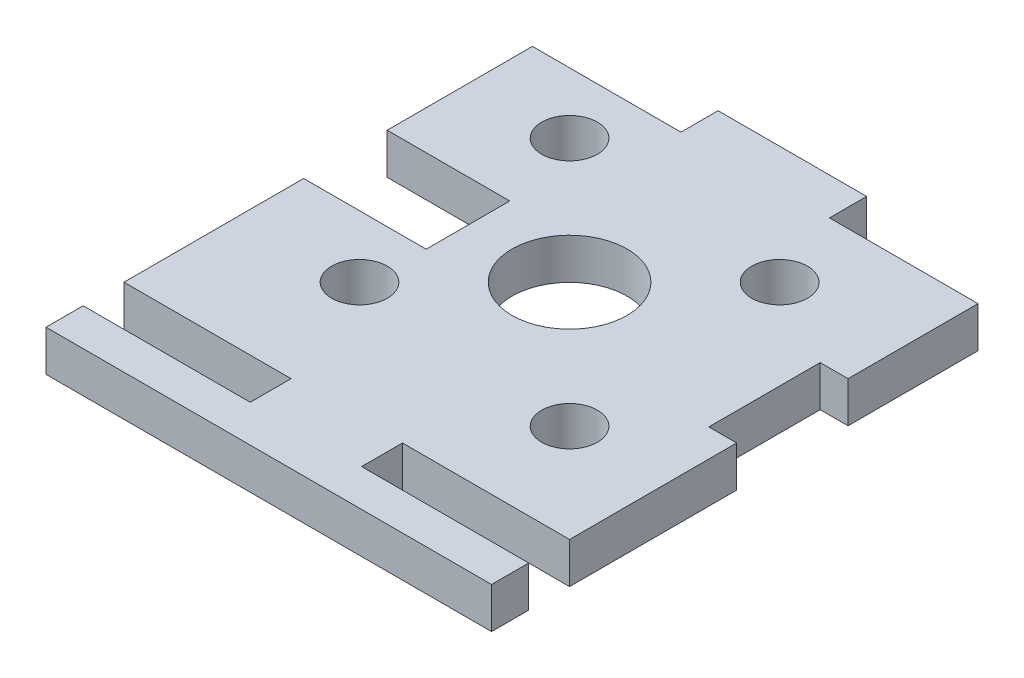
ISO-10303-21;
HEADER;
FILE_DESCRIPTION(('STEP AP214'),'2;1');
FILE_NAME('part.step','',(''),(''),'','','');
FILE_SCHEMA(('AUTOMOTIVE_DESIGN { 1 0 10303 214 1 1 1 1 }'));
ENDSEC;
DATA;
#1=APPLICATION_CONTEXT('core data for automotive mechanical design processes');
#2=APPLICATION_PROTOCOL_DEFINITION('international standard','automotive_design',2000,#1);
#3=PRODUCT_CONTEXT('',#1,'mechanical');
#4=PRODUCT('Part','Part','',(#3));
#5=PRODUCT_RELATED_PRODUCT_CATEGORY('part','',(#4));
#6=PRODUCT_DEFINITION_FORMATION('','',#4);
#7=PRODUCT_DEFINITION_CONTEXT('part definition',#1,'design');
#8=PRODUCT_DEFINITION('design','',#6,#7);
#9=PRODUCT_DEFINITION_SHAPE('','',#8);
#10=(LENGTH_UNIT() NAMED_UNIT(*) SI_UNIT(.MILLI.,.METRE.));
#11=(NAMED_UNIT(*) PLANE_ANGLE_UNIT() SI_UNIT($,.RADIAN.));
#12=(NAMED_UNIT(*) SI_UNIT($,.STERADIAN.) SOLID_ANGLE_UNIT());
#13=UNCERTAINTY_MEASURE_WITH_UNIT(LENGTH_MEASURE(1.E-05),#10,'distance_accuracy_value','');
#14=(GEOMETRIC_REPRESENTATION_CONTEXT(3) GLOBAL_UNCERTAINTY_ASSIGNED_CONTEXT((#13)) GLOBAL_UNIT_ASSIGNED_CONTEXT((#10,
#11,#12)) REPRESENTATION_CONTEXT('',''));
#15=CARTESIAN_POINT('',(0.,0.,0.));
#16=DIRECTION('',(0.,0.,1.));
#17=DIRECTION('',(1.,0.,0.));
#18=AXIS2_PLACEMENT_3D('',#15,#16,#17);
#19=CARTESIAN_POINT('',(-138.695425431337,2.2,0.));
#20=DIRECTION('',(-1.,0.,0.));
#21=DIRECTION('',(0.,0.,1.));
#22=AXIS2_PLACEMENT_3D('',#19,#20,#21);
#23=PLANE('',#22);
#24=DIRECTION('',(0.,0.,-1.));
#25=VECTOR('',#24,1.);
#26=CARTESIAN_POINT('',(-138.695425431337,0.,0.));
#27=LINE('',#26,#25);
#28=CARTESIAN_POINT('',(-138.695425431337,0.,51.8659042385541));
#29=VERTEX_POINT('',#28);
#30=CARTESIAN_POINT('',(-138.695425431337,0.,45.865904238554));
#31=VERTEX_POINT('',#30);
#32=EDGE_CURVE('E312',#29,#31,#27,.T.);
#33=ORIENTED_EDGE('',*,*,#32,.T.);
#34=DIRECTION('',(0.,-1.,0.));
#35=VECTOR('',#34,1.);
#36=CARTESIAN_POINT('',(-138.695425431337,2.2,45.865904238554));
#37=LINE('',#36,#35);
#38=CARTESIAN_POINT('',(-138.695425431337,2.2,45.865904238554));
#39=VERTEX_POINT('',#38);
#40=EDGE_CURVE('E11',#39,#31,#37,.T.);
#41=ORIENTED_EDGE('',*,*,#40,.F.);
#42=DIRECTION('',(0.,0.,-1.));
#43=VECTOR('',#42,1.);
#44=CARTESIAN_POINT('',(-138.695425431337,2.2,0.));
#45=LINE('',#44,#43);
#46=CARTESIAN_POINT('',(-138.695425431337,2.2,51.8659042385541));
#47=VERTEX_POINT('',#46);
#48=EDGE_CURVE('E234',#47,#39,#45,.T.);
#49=ORIENTED_EDGE('',*,*,#48,.F.);
#50=DIRECTION('',(0.,-1.,0.));
#51=VECTOR('',#50,1.);
#52=CARTESIAN_POINT('',(-138.695425431337,2.2,51.8659042385541));
#53=LINE('',#52,#51);
#54=EDGE_CURVE('E225',#47,#29,#53,.T.);
#55=ORIENTED_EDGE('',*,*,#54,.T.);
#56=EDGE_LOOP('',(#33,#41,#49,#55));
#57=FACE_BOUND('',#56,.T.);
#58=ADVANCED_FACE('F37',(#57),#23,.F.);
#59=CARTESIAN_POINT('',(-8.48689715514936E-13,2.2,45.8659042385566));
#60=DIRECTION('',(0.,0.,-1.));
#61=DIRECTION('',(-1.,0.,0.));
#62=AXIS2_PLACEMENT_3D('',#59,#60,#61);
#63=PLANE('',#62);
#64=DIRECTION('',(1.,0.,0.));
#65=VECTOR('',#64,1.);
#66=CARTESIAN_POINT('',(-8.48689715514936E-13,0.,45.8659042385566));
#67=LINE('',#66,#65);
#68=CARTESIAN_POINT('',(-137.195425431329,0.,45.865904238554));
#69=VERTEX_POINT('',#68);
#70=EDGE_CURVE('E306',#31,#69,#67,.T.);
#71=ORIENTED_EDGE('',*,*,#70,.T.);
#72=DIRECTION('',(0.,-1.,0.));
#73=VECTOR('',#72,1.);
#74=CARTESIAN_POINT('',(-137.195425431329,2.2,45.865904238554));
#75=LINE('',#74,#73);
#76=CARTESIAN_POINT('',(-137.195425431329,2.2,45.865904238554));
#77=VERTEX_POINT('',#76);
#78=EDGE_CURVE('E46',#77,#69,#75,.T.);
#79=ORIENTED_EDGE('',*,*,#78,.F.);
#80=DIRECTION('',(1.,0.,0.));
#81=VECTOR('',#80,1.);
#82=CARTESIAN_POINT('',(-8.48689715514936E-13,2.2,45.8659042385566));
#83=LINE('',#82,#81);
#84=EDGE_CURVE('E141',#39,#77,#83,.T.);
#85=ORIENTED_EDGE('',*,*,#84,.F.);
#86=ORIENTED_EDGE('',*,*,#40,.T.);
#87=EDGE_LOOP('',(#71,#79,#85,#86));
#88=FACE_BOUND('',#87,.T.);
#89=ADVANCED_FACE('F307',(#88),#63,.F.);
#90=CARTESIAN_POINT('',(-137.195425431329,2.2,0.));
#91=DIRECTION('',(1.,0.,0.));
#92=DIRECTION('',(0.,0.,-1.));
#93=AXIS2_PLACEMENT_3D('',#90,#91,#92);
#94=PLANE('',#93);
#95=DIRECTION('',(0.,0.,1.));
#96=VECTOR('',#95,1.);
#97=CARTESIAN_POINT('',(-137.195425431329,0.,0.));
#98=LINE('',#97,#96);
#99=CARTESIAN_POINT('',(-137.195425431329,0.,38.8659042385536));
#100=VERTEX_POINT('',#99);
#101=EDGE_CURVE('E256',#100,#69,#98,.T.);
#102=ORIENTED_EDGE('',*,*,#101,.F.);
#103=DIRECTION('',(0.,-1.,0.));
#104=VECTOR('',#103,1.);
#105=CARTESIAN_POINT('',(-137.195425431329,2.2,38.8659042385536));
#106=LINE('',#105,#104);
#107=CARTESIAN_POINT('',(-137.195425431329,2.2,38.8659042385536));
#108=VERTEX_POINT('',#107);
#109=EDGE_CURVE('E301',#108,#100,#106,.T.);
#110=ORIENTED_EDGE('',*,*,#109,.F.);
#111=DIRECTION('',(0.,0.,1.));
#112=VECTOR('',#111,1.);
#113=CARTESIAN_POINT('',(-137.195425431329,2.2,0.));
#114=LINE('',#113,#112);
#115=EDGE_CURVE('E224',#108,#77,#114,.T.);
#116=ORIENTED_EDGE('',*,*,#115,.T.);
#117=ORIENTED_EDGE('',*,*,#78,.T.);
#118=EDGE_LOOP('',(#102,#110,#116,#117));
#119=FACE_BOUND('',#118,.T.);
#120=ADVANCED_FACE('F304',(#119),#94,.T.);
#121=CARTESIAN_POINT('',(-5.3937277198151E-13,2.2,38.8659042385556));
#122=DIRECTION('',(0.,0.,1.));
#123=DIRECTION('',(1.,0.,0.));
#124=AXIS2_PLACEMENT_3D('',#121,#122,#123);
#125=PLANE('',#124);
#126=DIRECTION('',(-1.,0.,0.));
#127=VECTOR('',#126,1.);
#128=CARTESIAN_POINT('',(-5.3937277198151E-13,0.,38.8659042385556));
#129=LINE('',#128,#127);
#130=CARTESIAN_POINT('',(-145.195425431338,0.,38.8659042385536));
#131=VERTEX_POINT('',#130);
#132=EDGE_CURVE('E317',#100,#131,#129,.T.);
#133=ORIENTED_EDGE('',*,*,#132,.T.);
#134=DIRECTION('',(0.,-1.,0.));
#135=VECTOR('',#134,1.);
#136=CARTESIAN_POINT('',(-145.195425431338,2.2,38.8659042385536));
#137=LINE('',#136,#135);
#138=CARTESIAN_POINT('',(-145.195425431338,2.2,38.8659042385536));
#139=VERTEX_POINT('',#138);
#140=EDGE_CURVE('E298',#139,#131,#137,.T.);
#141=ORIENTED_EDGE('',*,*,#140,.F.);
#142=DIRECTION('',(-1.,0.,0.));
#143=VECTOR('',#142,1.);
#144=CARTESIAN_POINT('',(-5.3937277198151E-13,2.2,38.8659042385556));
#145=LINE('',#144,#143);
#146=EDGE_CURVE('E230',#108,#139,#145,.T.);
#147=ORIENTED_EDGE('',*,*,#146,.F.);
#148=ORIENTED_EDGE('',*,*,#109,.T.);
#149=EDGE_LOOP('',(#133,#141,#147,#148));
#150=FACE_BOUND('',#149,.T.);
#151=ADVANCED_FACE('F560',(#150),#125,.F.);
#152=CARTESIAN_POINT('',(-145.195425431338,2.2,0.));
#153=DIRECTION('',(-1.,0.,0.));
#154=DIRECTION('',(0.,0.,1.));
#155=AXIS2_PLACEMENT_3D('',#152,#153,#154);
#156=PLANE('',#155);
#157=DIRECTION('',(0.,0.,-1.));
#158=VECTOR('',#157,1.);
#159=CARTESIAN_POINT('',(-145.195425431338,0.,0.));
#160=LINE('',#159,#158);
#161=CARTESIAN_POINT('',(-145.195425431338,0.,36.8659042385471));
#162=VERTEX_POINT('',#161);
#163=EDGE_CURVE('E318',#131,#162,#160,.T.);
#164=ORIENTED_EDGE('',*,*,#163,.T.);
#165=DIRECTION('',(0.,-1.,0.));
#166=VECTOR('',#165,1.);
#167=CARTESIAN_POINT('',(-145.195425431338,2.2,36.8659042385471));
#168=LINE('',#167,#166);
#169=CARTESIAN_POINT('',(-145.195425431338,2.2,36.8659042385471));
#170=VERTEX_POINT('',#169);
#171=EDGE_CURVE('E295',#170,#162,#168,.T.);
#172=ORIENTED_EDGE('',*,*,#171,.F.);
#173=DIRECTION('',(0.,0.,-1.));
#174=VECTOR('',#173,1.);
#175=CARTESIAN_POINT('',(-145.195425431338,2.2,0.));
#176=LINE('',#175,#174);
#177=EDGE_CURVE('E233',#139,#170,#176,.T.);
#178=ORIENTED_EDGE('',*,*,#177,.F.);
#179=ORIENTED_EDGE('',*,*,#140,.T.);
#180=EDGE_LOOP('',(#164,#172,#178,#179));
#181=FACE_BOUND('',#180,.T.);
#182=ADVANCED_FACE('F433',(#181),#156,.F.);
#183=CARTESIAN_POINT('',(0.,2.2,36.8659042385471));
#184=DIRECTION('',(0.,0.,1.));
#185=DIRECTION('',(1.,0.,0.));
#186=AXIS2_PLACEMENT_3D('',#183,#184,#185);
#187=PLANE('',#186);
#188=DIRECTION('',(-1.,0.,0.));
#189=VECTOR('',#188,1.);
#190=CARTESIAN_POINT('',(0.,0.,36.8659042385471));
#191=LINE('',#190,#189);
#192=CARTESIAN_POINT('',(-153.195425431338,0.,36.8659042385471));
#193=VERTEX_POINT('',#192);
#194=EDGE_CURVE('E323',#162,#193,#191,.T.);
#195=ORIENTED_EDGE('',*,*,#194,.T.);
#196=DIRECTION('',(0.,-1.,0.));
#197=VECTOR('',#196,1.);
#198=CARTESIAN_POINT('',(-153.195425431338,2.2,36.8659042385471));
#199=LINE('',#198,#197);
#200=CARTESIAN_POINT('',(-153.195425431338,2.2,36.8659042385471));
#201=VERTEX_POINT('',#200);
#202=EDGE_CURVE('E292',#201,#193,#199,.T.);
#203=ORIENTED_EDGE('',*,*,#202,.F.);
#204=DIRECTION('',(-1.,0.,0.));
#205=VECTOR('',#204,1.);
#206=CARTESIAN_POINT('',(0.,2.2,36.8659042385471));
#207=LINE('',#206,#205);
#208=EDGE_CURVE('E424',#170,#201,#207,.T.);
#209=ORIENTED_EDGE('',*,*,#208,.F.);
#210=ORIENTED_EDGE('',*,*,#171,.T.);
#211=EDGE_LOOP('',(#195,#203,#209,#210));
#212=FACE_BOUND('',#211,.T.);
#213=ADVANCED_FACE('F436',(#212),#187,.F.);
#214=CARTESIAN_POINT('',(-153.195425431338,2.2,0.));
#215=DIRECTION('',(1.,0.,0.));
#216=DIRECTION('',(0.,0.,-1.));
#217=AXIS2_PLACEMENT_3D('',#214,#215,#216);
#218=PLANE('',#217);
#219=DIRECTION('',(0.,0.,1.));
#220=VECTOR('',#219,1.);
#221=CARTESIAN_POINT('',(-153.195425431338,0.,0.));
#222=LINE('',#221,#220);
#223=CARTESIAN_POINT('',(-153.195425431338,0.,38.8659042385533));
#224=VERTEX_POINT('',#223);
#225=EDGE_CURVE('E325',#193,#224,#222,.T.);
#226=ORIENTED_EDGE('',*,*,#225,.T.);
#227=DIRECTION('',(0.,-1.,0.));
#228=VECTOR('',#227,1.);
#229=CARTESIAN_POINT('',(-153.195425431338,2.2,38.8659042385533));
#230=LINE('',#229,#228);
#231=CARTESIAN_POINT('',(-153.195425431338,2.2,38.8659042385533));
#232=VERTEX_POINT('',#231);
#233=EDGE_CURVE('E289',#232,#224,#230,.T.);
#234=ORIENTED_EDGE('',*,*,#233,.F.);
#235=DIRECTION('',(0.,0.,1.));
#236=VECTOR('',#235,1.);
#237=CARTESIAN_POINT('',(-153.195425431338,2.2,0.));
#238=LINE('',#237,#236);
#239=EDGE_CURVE('E422',#201,#232,#238,.T.);
#240=ORIENTED_EDGE('',*,*,#239,.F.);
#241=ORIENTED_EDGE('',*,*,#202,.T.);
#242=EDGE_LOOP('',(#226,#234,#240,#241));
#243=FACE_BOUND('',#242,.T.);
#244=ADVANCED_FACE('F441',(#243),#218,.F.);
#245=CARTESIAN_POINT('',(-5.39372771981501E-13,2.2,38.8659042385555));
#246=DIRECTION('',(0.,0.,1.));
#247=DIRECTION('',(1.,0.,0.));
#248=AXIS2_PLACEMENT_3D('',#245,#246,#247);
#249=PLANE('',#248);
#250=DIRECTION('',(-1.,0.,0.));
#251=VECTOR('',#250,1.);
#252=CARTESIAN_POINT('',(-5.39372771981501E-13,0.,38.8659042385555));
#253=LINE('',#252,#251);
#254=CARTESIAN_POINT('',(-161.195425431338,0.,38.8659042385532));
#255=VERTEX_POINT('',#254);
#256=EDGE_CURVE('E327',#224,#255,#253,.T.);
#257=ORIENTED_EDGE('',*,*,#256,.T.);
#258=DIRECTION('',(0.,-1.,0.));
#259=VECTOR('',#258,1.);
#260=CARTESIAN_POINT('',(-161.195425431338,2.2,38.8659042385532));
#261=LINE('',#260,#259);
#262=CARTESIAN_POINT('',(-161.195425431338,2.2,38.8659042385532));
#263=VERTEX_POINT('',#262);
#264=EDGE_CURVE('E287',#263,#255,#261,.T.);
#265=ORIENTED_EDGE('',*,*,#264,.F.);
#266=DIRECTION('',(-1.,0.,0.));
#267=VECTOR('',#266,1.);
#268=CARTESIAN_POINT('',(-5.39372771981501E-13,2.2,38.8659042385555));
#269=LINE('',#268,#267);
#270=EDGE_CURVE('E420',#232,#263,#269,.T.);
#271=ORIENTED_EDGE('',*,*,#270,.F.);
#272=ORIENTED_EDGE('',*,*,#233,.T.);
#273=EDGE_LOOP('',(#257,#265,#271,#272));
#274=FACE_BOUND('',#273,.T.);
#275=ADVANCED_FACE('F447',(#274),#249,.F.);
#276=CARTESIAN_POINT('',(-161.195425431344,2.2,0.));
#277=DIRECTION('',(-1.,0.,0.));
#278=DIRECTION('',(0.,0.,1.));
#279=AXIS2_PLACEMENT_3D('',#276,#277,#278);
#280=PLANE('',#279);
#281=DIRECTION('',(0.,0.,-1.));
#282=VECTOR('',#281,1.);
#283=CARTESIAN_POINT('',(-161.195425431344,0.,0.));
#284=LINE('',#283,#282);
#285=CARTESIAN_POINT('',(-161.195425431344,0.,46.6878762578517));
#286=VERTEX_POINT('',#285);
#287=EDGE_CURVE('E330',#286,#255,#284,.T.);
#288=ORIENTED_EDGE('',*,*,#287,.F.);
#289=DIRECTION('',(0.,-1.,0.));
#290=VECTOR('',#289,1.);
#291=CARTESIAN_POINT('',(-161.195425431344,2.2,46.6878762578517));
#292=LINE('',#291,#290);
#293=CARTESIAN_POINT('',(-161.195425431344,2.2,46.6878762578517));
#294=VERTEX_POINT('',#293);
#295=EDGE_CURVE('E285',#294,#286,#292,.T.);
#296=ORIENTED_EDGE('',*,*,#295,.F.);
#297=DIRECTION('',(0.,0.,-1.));
#298=VECTOR('',#297,1.);
#299=CARTESIAN_POINT('',(-161.195425431344,2.2,0.));
#300=LINE('',#299,#298);
#301=EDGE_CURVE('E417',#294,#263,#300,.T.);
#302=ORIENTED_EDGE('',*,*,#301,.T.);
#303=ORIENTED_EDGE('',*,*,#264,.T.);
#304=EDGE_LOOP('',(#288,#296,#302,#303));
#305=FACE_BOUND('',#304,.T.);
#306=ADVANCED_FACE('F451',(#305),#280,.T.);
#307=CARTESIAN_POINT('',(0.,2.2,46.6878762578517));
#308=DIRECTION('',(0.,0.,1.));
#309=DIRECTION('',(1.,0.,0.));
#310=AXIS2_PLACEMENT_3D('',#307,#308,#309);
#311=PLANE('',#310);
#312=DIRECTION('',(-1.,0.,0.));
#313=VECTOR('',#312,1.);
#314=CARTESIAN_POINT('',(0.,0.,46.6878762578517));
#315=LINE('',#314,#313);
#316=CARTESIAN_POINT('',(-154.595425431342,0.,46.6878762578517));
#317=VERTEX_POINT('',#316);
#318=EDGE_CURVE('E333',#317,#286,#315,.T.);
#319=ORIENTED_EDGE('',*,*,#318,.F.);
#320=DIRECTION('',(0.,-1.,0.));
#321=VECTOR('',#320,1.);
#322=CARTESIAN_POINT('',(-154.595425431342,2.2,46.6878762578517));
#323=LINE('',#322,#321);
#324=CARTESIAN_POINT('',(-154.595425431342,2.2,46.6878762578517));
#325=VERTEX_POINT('',#324);
#326=EDGE_CURVE('E283',#325,#317,#323,.T.);
#327=ORIENTED_EDGE('',*,*,#326,.F.);
#328=DIRECTION('',(-1.,0.,0.));
#329=VECTOR('',#328,1.);
#330=CARTESIAN_POINT('',(0.,2.2,46.6878762578517));
#331=LINE('',#330,#329);
#332=EDGE_CURVE('E414',#325,#294,#331,.T.);
#333=ORIENTED_EDGE('',*,*,#332,.T.);
#334=ORIENTED_EDGE('',*,*,#295,.T.);
#335=EDGE_LOOP('',(#319,#327,#333,#334));
#336=FACE_BOUND('',#335,.T.);
#337=ADVANCED_FACE('F454',(#336),#311,.T.);
#338=CARTESIAN_POINT('',(-154.595425431342,2.2,0.));
#339=DIRECTION('',(-1.,0.,0.));
#340=DIRECTION('',(0.,0.,1.));
#341=AXIS2_PLACEMENT_3D('',#338,#339,#340);
#342=PLANE('',#341);
#343=DIRECTION('',(0.,0.,-1.));
#344=VECTOR('',#343,1.);
#345=CARTESIAN_POINT('',(-154.595425431342,0.,0.));
#346=LINE('',#345,#344);
#347=CARTESIAN_POINT('',(-154.595425431342,0.,51.1878762578712));
#348=VERTEX_POINT('',#347);
#349=EDGE_CURVE('E336',#348,#317,#346,.T.);
#350=ORIENTED_EDGE('',*,*,#349,.F.);
#351=DIRECTION('',(0.,-1.,0.));
#352=VECTOR('',#351,1.);
#353=CARTESIAN_POINT('',(-154.595425431342,2.2,51.1878762578712));
#354=LINE('',#353,#352);
#355=CARTESIAN_POINT('',(-154.595425431342,2.2,51.1878762578712));
#356=VERTEX_POINT('',#355);
#357=EDGE_CURVE('E281',#356,#348,#354,.T.);
#358=ORIENTED_EDGE('',*,*,#357,.F.);
#359=DIRECTION('',(0.,0.,-1.));
#360=VECTOR('',#359,1.);
#361=CARTESIAN_POINT('',(-154.595425431342,2.2,0.));
#362=LINE('',#361,#360);
#363=EDGE_CURVE('E411',#356,#325,#362,.T.);
#364=ORIENTED_EDGE('',*,*,#363,.T.);
#365=ORIENTED_EDGE('',*,*,#326,.T.);
#366=EDGE_LOOP('',(#350,#358,#364,#365));
#367=FACE_BOUND('',#366,.T.);
#368=ADVANCED_FACE('F458',(#367),#342,.T.);
#369=CARTESIAN_POINT('',(0.,2.2,51.1878762578712));
#370=DIRECTION('',(0.,0.,1.));
#371=DIRECTION('',(1.,0.,0.));
#372=AXIS2_PLACEMENT_3D('',#369,#370,#371);
#373=PLANE('',#372);
#374=DIRECTION('',(-1.,0.,0.));
#375=VECTOR('',#374,1.);
#376=CARTESIAN_POINT('',(0.,0.,51.1878762578712));
#377=LINE('',#376,#375);
#378=CARTESIAN_POINT('',(-161.195425431344,0.,51.1878762578712));
#379=VERTEX_POINT('',#378);
#380=EDGE_CURVE('E339',#348,#379,#377,.T.);
#381=ORIENTED_EDGE('',*,*,#380,.T.);
#382=DIRECTION('',(0.,-1.,0.));
#383=VECTOR('',#382,1.);
#384=CARTESIAN_POINT('',(-161.195425431344,2.2,51.1878762578712));
#385=LINE('',#384,#383);
#386=CARTESIAN_POINT('',(-161.195425431344,2.2,51.1878762578712));
#387=VERTEX_POINT('',#386);
#388=EDGE_CURVE('E279',#387,#379,#385,.T.);
#389=ORIENTED_EDGE('',*,*,#388,.F.);
#390=DIRECTION('',(-1.,0.,0.));
#391=VECTOR('',#390,1.);
#392=CARTESIAN_POINT('',(0.,2.2,51.1878762578712));
#393=LINE('',#392,#391);
#394=EDGE_CURVE('E409',#356,#387,#393,.T.);
#395=ORIENTED_EDGE('',*,*,#394,.F.);
#396=ORIENTED_EDGE('',*,*,#357,.T.);
#397=EDGE_LOOP('',(#381,#389,#395,#396));
#398=FACE_BOUND('',#397,.T.);
#399=ADVANCED_FACE('F463',(#398),#373,.F.);
#400=CARTESIAN_POINT('',(-161.195425431344,2.2,0.));
#401=DIRECTION('',(-1.,0.,0.));
#402=DIRECTION('',(0.,0.,1.));
#403=AXIS2_PLACEMENT_3D('',#400,#401,#402);
#404=PLANE('',#403);
#405=DIRECTION('',(0.,0.,-1.));
#406=VECTOR('',#405,1.);
#407=CARTESIAN_POINT('',(-161.195425431344,0.,0.));
#408=LINE('',#407,#406);
#409=CARTESIAN_POINT('',(-161.195425431344,0.,60.8659042385175));
#410=VERTEX_POINT('',#409);
#411=EDGE_CURVE('E342',#410,#379,#408,.T.);
#412=ORIENTED_EDGE('',*,*,#411,.F.);
#413=DIRECTION('',(0.,-1.,0.));
#414=VECTOR('',#413,1.);
#415=CARTESIAN_POINT('',(-161.195425431344,2.2,60.8659042385175));
#416=LINE('',#415,#414);
#417=CARTESIAN_POINT('',(-161.195425431344,2.2,60.8659042385175));
#418=VERTEX_POINT('',#417);
#419=EDGE_CURVE('E277',#418,#410,#416,.T.);
#420=ORIENTED_EDGE('',*,*,#419,.F.);
#421=DIRECTION('',(0.,0.,-1.));
#422=VECTOR('',#421,1.);
#423=CARTESIAN_POINT('',(-161.195425431344,2.2,0.));
#424=LINE('',#423,#422);
#425=EDGE_CURVE('E406',#418,#387,#424,.T.);
#426=ORIENTED_EDGE('',*,*,#425,.T.);
#427=ORIENTED_EDGE('',*,*,#388,.T.);
#428=EDGE_LOOP('',(#412,#420,#426,#427));
#429=FACE_BOUND('',#428,.T.);
#430=ADVANCED_FACE('F584',(#429),#404,.T.);
#431=CARTESIAN_POINT('',(0.,2.2,60.8659042385175));
#432=DIRECTION('',(0.,0.,1.));
#433=DIRECTION('',(1.,0.,0.));
#434=AXIS2_PLACEMENT_3D('',#431,#432,#433);
#435=PLANE('',#434);
#436=DIRECTION('',(-1.,0.,0.));
#437=VECTOR('',#436,1.);
#438=CARTESIAN_POINT('',(0.,0.,60.8659042385175));
#439=LINE('',#438,#437);
#440=CARTESIAN_POINT('',(-152.195425431348,0.,60.8659042385175));
#441=VERTEX_POINT('',#440);
#442=EDGE_CURVE('E345',#441,#410,#439,.T.);
#443=ORIENTED_EDGE('',*,*,#442,.F.);
#444=DIRECTION('',(0.,-1.,0.));
#445=VECTOR('',#444,1.);
#446=CARTESIAN_POINT('',(-152.195425431348,2.2,60.8659042385175));
#447=LINE('',#446,#445);
#448=CARTESIAN_POINT('',(-152.195425431348,2.2,60.8659042385175));
#449=VERTEX_POINT('',#448);
#450=EDGE_CURVE('E275',#449,#441,#447,.T.);
#451=ORIENTED_EDGE('',*,*,#450,.F.);
#452=DIRECTION('',(-1.,0.,0.));
#453=VECTOR('',#452,1.);
#454=CARTESIAN_POINT('',(0.,2.2,60.8659042385175));
#455=LINE('',#454,#453);
#456=EDGE_CURVE('E403',#449,#418,#455,.T.);
#457=ORIENTED_EDGE('',*,*,#456,.T.);
#458=ORIENTED_EDGE('',*,*,#419,.T.);
#459=EDGE_LOOP('',(#443,#451,#457,#458));
#460=FACE_BOUND('',#459,.T.);
#461=ADVANCED_FACE('F470',(#460),#435,.T.);
#462=CARTESIAN_POINT('',(-152.195425431348,2.2,0.));
#463=DIRECTION('',(-1.,0.,0.));
#464=DIRECTION('',(0.,0.,1.));
#465=AXIS2_PLACEMENT_3D('',#462,#463,#464);
#466=PLANE('',#465);
#467=DIRECTION('',(0.,0.,-1.));
#468=VECTOR('',#467,1.);
#469=CARTESIAN_POINT('',(-152.195425431348,0.,0.));
#470=LINE('',#469,#468);
#471=CARTESIAN_POINT('',(-152.195425431348,0.,63.0659042385194));
#472=VERTEX_POINT('',#471);
#473=EDGE_CURVE('E348',#472,#441,#470,.T.);
#474=ORIENTED_EDGE('',*,*,#473,.F.);
#475=DIRECTION('',(0.,-1.,0.));
#476=VECTOR('',#475,1.);
#477=CARTESIAN_POINT('',(-152.195425431348,2.2,63.0659042385194));
#478=LINE('',#477,#476);
#479=CARTESIAN_POINT('',(-152.195425431348,2.2,63.0659042385194));
#480=VERTEX_POINT('',#479);
#481=EDGE_CURVE('E273',#480,#472,#478,.T.);
#482=ORIENTED_EDGE('',*,*,#481,.F.);
#483=DIRECTION('',(0.,0.,-1.));
#484=VECTOR('',#483,1.);
#485=CARTESIAN_POINT('',(-152.195425431348,2.2,0.));
#486=LINE('',#485,#484);
#487=EDGE_CURVE('E400',#480,#449,#486,.T.);
#488=ORIENTED_EDGE('',*,*,#487,.T.);
#489=ORIENTED_EDGE('',*,*,#450,.T.);
#490=EDGE_LOOP('',(#474,#482,#488,#489));
#491=FACE_BOUND('',#490,.T.);
#492=ADVANCED_FACE('F474',(#491),#466,.T.);
#493=CARTESIAN_POINT('',(0.,2.2,63.0659042385194));
#494=DIRECTION('',(0.,0.,1.));
#495=DIRECTION('',(1.,0.,0.));
#496=AXIS2_PLACEMENT_3D('',#493,#494,#495);
#497=PLANE('',#496);
#498=DIRECTION('',(-1.,0.,0.));
#499=VECTOR('',#498,1.);
#500=CARTESIAN_POINT('',(0.,0.,63.0659042385194));
#501=LINE('',#500,#499);
#502=CARTESIAN_POINT('',(-161.195425431349,0.,63.0659042385194));
#503=VERTEX_POINT('',#502);
#504=EDGE_CURVE('E351',#472,#503,#501,.T.);
#505=ORIENTED_EDGE('',*,*,#504,.T.);
#506=DIRECTION('',(0.,-1.,0.));
#507=VECTOR('',#506,1.);
#508=CARTESIAN_POINT('',(-161.195425431349,2.2,63.0659042385194));
#509=LINE('',#508,#507);
#510=CARTESIAN_POINT('',(-161.195425431349,2.2,63.0659042385194));
#511=VERTEX_POINT('',#510);
#512=EDGE_CURVE('E271',#511,#503,#509,.T.);
#513=ORIENTED_EDGE('',*,*,#512,.F.);
#514=DIRECTION('',(-1.,0.,0.));
#515=VECTOR('',#514,1.);
#516=CARTESIAN_POINT('',(0.,2.2,63.0659042385194));
#517=LINE('',#516,#515);
#518=EDGE_CURVE('E398',#480,#511,#517,.T.);
#519=ORIENTED_EDGE('',*,*,#518,.F.);
#520=ORIENTED_EDGE('',*,*,#481,.T.);
#521=EDGE_LOOP('',(#505,#513,#519,#520));
#522=FACE_BOUND('',#521,.T.);
#523=ADVANCED_FACE('F480',(#522),#497,.F.);
#524=CARTESIAN_POINT('',(-161.195425431349,2.2,0.));
#525=DIRECTION('',(-1.,0.,0.));
#526=DIRECTION('',(0.,0.,1.));
#527=AXIS2_PLACEMENT_3D('',#524,#525,#526);
#528=PLANE('',#527);
#529=DIRECTION('',(0.,0.,-1.));
#530=VECTOR('',#529,1.);
#531=CARTESIAN_POINT('',(-161.195425431349,0.,0.));
#532=LINE('',#531,#530);
#533=CARTESIAN_POINT('',(-161.195425431349,0.,65.0659042385186));
#534=VERTEX_POINT('',#533);
#535=EDGE_CURVE('E354',#534,#503,#532,.T.);
#536=ORIENTED_EDGE('',*,*,#535,.F.);
#537=DIRECTION('',(0.,-1.,0.));
#538=VECTOR('',#537,1.);
#539=CARTESIAN_POINT('',(-161.195425431349,2.2,65.0659042385186));
#540=LINE('',#539,#538);
#541=CARTESIAN_POINT('',(-161.195425431349,2.2,65.0659042385186));
#542=VERTEX_POINT('',#541);
#543=EDGE_CURVE('E269',#542,#534,#540,.T.);
#544=ORIENTED_EDGE('',*,*,#543,.F.);
#545=DIRECTION('',(0.,0.,-1.));
#546=VECTOR('',#545,1.);
#547=CARTESIAN_POINT('',(-161.195425431349,2.2,0.));
#548=LINE('',#547,#546);
#549=EDGE_CURVE('E395',#542,#511,#548,.T.);
#550=ORIENTED_EDGE('',*,*,#549,.T.);
#551=ORIENTED_EDGE('',*,*,#512,.T.);
#552=EDGE_LOOP('',(#536,#544,#550,#551));
#553=FACE_BOUND('',#552,.T.);
#554=ADVANCED_FACE('F484',(#553),#528,.T.);
#555=CARTESIAN_POINT('',(0.,2.2,65.0659042385186));
#556=DIRECTION('',(0.,0.,1.));
#557=DIRECTION('',(1.,0.,0.));
#558=AXIS2_PLACEMENT_3D('',#555,#556,#557);
#559=PLANE('',#558);
#560=DIRECTION('',(-1.,0.,0.));
#561=VECTOR('',#560,1.);
#562=CARTESIAN_POINT('',(0.,0.,65.0659042385186));
#563=LINE('',#562,#561);
#564=CARTESIAN_POINT('',(-137.195425431351,0.,65.0659042385186));
#565=VERTEX_POINT('',#564);
#566=EDGE_CURVE('E357',#565,#534,#563,.T.);
#567=ORIENTED_EDGE('',*,*,#566,.F.);
#568=DIRECTION('',(0.,-1.,0.));
#569=VECTOR('',#568,1.);
#570=CARTESIAN_POINT('',(-137.195425431351,2.2,65.0659042385186));
#571=LINE('',#570,#569);
#572=CARTESIAN_POINT('',(-137.195425431351,2.2,65.0659042385186));
#573=VERTEX_POINT('',#572);
#574=EDGE_CURVE('E267',#573,#565,#571,.T.);
#575=ORIENTED_EDGE('',*,*,#574,.F.);
#576=DIRECTION('',(-1.,0.,0.));
#577=VECTOR('',#576,1.);
#578=CARTESIAN_POINT('',(0.,2.2,65.0659042385186));
#579=LINE('',#578,#577);
#580=EDGE_CURVE('E392',#573,#542,#579,.T.);
#581=ORIENTED_EDGE('',*,*,#580,.T.);
#582=ORIENTED_EDGE('',*,*,#543,.T.);
#583=EDGE_LOOP('',(#567,#575,#581,#582));
#584=FACE_BOUND('',#583,.T.);
#585=ADVANCED_FACE('F487',(#584),#559,.T.);
#586=CARTESIAN_POINT('',(-137.195425431351,2.2,0.));
#587=DIRECTION('',(1.,0.,0.));
#588=DIRECTION('',(0.,0.,-1.));
#589=AXIS2_PLACEMENT_3D('',#586,#587,#588);
#590=PLANE('',#589);
#591=DIRECTION('',(0.,0.,1.));
#592=VECTOR('',#591,1.);
#593=CARTESIAN_POINT('',(-137.195425431351,0.,0.));
#594=LINE('',#593,#592);
#595=CARTESIAN_POINT('',(-137.195425431351,0.,63.0659042385169));
#596=VERTEX_POINT('',#595);
#597=EDGE_CURVE('E360',#596,#565,#594,.T.);
#598=ORIENTED_EDGE('',*,*,#597,.F.);
#599=DIRECTION('',(0.,-1.,0.));
#600=VECTOR('',#599,1.);
#601=CARTESIAN_POINT('',(-137.195425431351,2.2,63.0659042385169));
#602=LINE('',#601,#600);
#603=CARTESIAN_POINT('',(-137.195425431351,2.2,63.0659042385169));
#604=VERTEX_POINT('',#603);
#605=EDGE_CURVE('E265',#604,#596,#602,.T.);
#606=ORIENTED_EDGE('',*,*,#605,.F.);
#607=DIRECTION('',(0.,0.,1.));
#608=VECTOR('',#607,1.);
#609=CARTESIAN_POINT('',(-137.195425431351,2.2,0.));
#610=LINE('',#609,#608);
#611=EDGE_CURVE('E389',#604,#573,#610,.T.);
#612=ORIENTED_EDGE('',*,*,#611,.T.);
#613=ORIENTED_EDGE('',*,*,#574,.T.);
#614=EDGE_LOOP('',(#598,#606,#612,#613));
#615=FACE_BOUND('',#614,.T.);
#616=ADVANCED_FACE('F491',(#615),#590,.T.);
#617=CARTESIAN_POINT('',(0.,2.2,63.0659042385169));
#618=DIRECTION('',(0.,0.,1.));
#619=DIRECTION('',(1.,0.,0.));
#620=AXIS2_PLACEMENT_3D('',#617,#618,#619);
#621=PLANE('',#620);
#622=DIRECTION('',(-1.,0.,0.));
#623=VECTOR('',#622,1.);
#624=CARTESIAN_POINT('',(0.,0.,63.0659042385169));
#625=LINE('',#624,#623);
#626=CARTESIAN_POINT('',(-146.195425431351,0.,63.0659042385169));
#627=VERTEX_POINT('',#626);
#628=EDGE_CURVE('E363',#596,#627,#625,.T.);
#629=ORIENTED_EDGE('',*,*,#628,.T.);
#630=DIRECTION('',(0.,-1.,0.));
#631=VECTOR('',#630,1.);
#632=CARTESIAN_POINT('',(-146.195425431351,2.2,63.0659042385169));
#633=LINE('',#632,#631);
#634=CARTESIAN_POINT('',(-146.195425431351,2.2,63.0659042385169));
#635=VERTEX_POINT('',#634);
#636=EDGE_CURVE('E263',#635,#627,#633,.T.);
#637=ORIENTED_EDGE('',*,*,#636,.F.);
#638=DIRECTION('',(-1.,0.,0.));
#639=VECTOR('',#638,1.);
#640=CARTESIAN_POINT('',(0.,2.2,63.0659042385169));
#641=LINE('',#640,#639);
#642=EDGE_CURVE('E387',#604,#635,#641,.T.);
#643=ORIENTED_EDGE('',*,*,#642,.F.);
#644=ORIENTED_EDGE('',*,*,#605,.T.);
#645=EDGE_LOOP('',(#629,#637,#643,#644));
#646=FACE_BOUND('',#645,.T.);
#647=ADVANCED_FACE('F495',(#646),#621,.F.);
#648=CARTESIAN_POINT('',(-146.195425431351,2.2,0.));
#649=DIRECTION('',(1.,0.,0.));
#650=DIRECTION('',(0.,0.,-1.));
#651=AXIS2_PLACEMENT_3D('',#648,#649,#650);
#652=PLANE('',#651);
#653=DIRECTION('',(0.,0.,1.));
#654=VECTOR('',#653,1.);
#655=CARTESIAN_POINT('',(-146.195425431351,0.,0.));
#656=LINE('',#655,#654);
#657=CARTESIAN_POINT('',(-146.195425431351,0.,60.8659042385118));
#658=VERTEX_POINT('',#657);
#659=EDGE_CURVE('E365',#658,#627,#656,.T.);
#660=ORIENTED_EDGE('',*,*,#659,.F.);
#661=DIRECTION('',(0.,-1.,0.));
#662=VECTOR('',#661,1.);
#663=CARTESIAN_POINT('',(-146.195425431351,2.2,60.8659042385118));
#664=LINE('',#663,#662);
#665=CARTESIAN_POINT('',(-146.195425431351,2.2,60.8659042385118));
#666=VERTEX_POINT('',#665);
#667=EDGE_CURVE('E214',#666,#658,#664,.T.);
#668=ORIENTED_EDGE('',*,*,#667,.F.);
#669=DIRECTION('',(0.,0.,1.));
#670=VECTOR('',#669,1.);
#671=CARTESIAN_POINT('',(-146.195425431351,2.2,0.));
#672=LINE('',#671,#670);
#673=EDGE_CURVE('E220',#666,#635,#672,.T.);
#674=ORIENTED_EDGE('',*,*,#673,.T.);
#675=ORIENTED_EDGE('',*,*,#636,.T.);
#676=EDGE_LOOP('',(#660,#668,#674,#675));
#677=FACE_BOUND('',#676,.T.);
#678=ADVANCED_FACE('F497',(#677),#652,.T.);
#679=CARTESIAN_POINT('',(0.,2.2,60.8659042385118));
#680=DIRECTION('',(0.,0.,1.));
#681=DIRECTION('',(1.,0.,0.));
#682=AXIS2_PLACEMENT_3D('',#679,#680,#681);
#683=PLANE('',#682);
#684=DIRECTION('',(-1.,0.,0.));
#685=VECTOR('',#684,1.);
#686=CARTESIAN_POINT('',(0.,0.,60.8659042385118));
#687=LINE('',#686,#685);
#688=CARTESIAN_POINT('',(-137.195425431329,0.,60.8659042385118));
#689=VERTEX_POINT('',#688);
#690=EDGE_CURVE('E209',#689,#658,#687,.T.);
#691=ORIENTED_EDGE('',*,*,#690,.F.);
#692=DIRECTION('',(0.,-1.,0.));
#693=VECTOR('',#692,1.);
#694=CARTESIAN_POINT('',(-137.195425431329,2.2,60.8659042385118));
#695=LINE('',#694,#693);
#696=CARTESIAN_POINT('',(-137.195425431329,2.2,60.8659042385118));
#697=VERTEX_POINT('',#696);
#698=EDGE_CURVE('E204',#697,#689,#695,.T.);
#699=ORIENTED_EDGE('',*,*,#698,.F.);
#700=DIRECTION('',(-1.,0.,0.));
#701=VECTOR('',#700,1.);
#702=CARTESIAN_POINT('',(0.,2.2,60.8659042385118));
#703=LINE('',#702,#701);
#704=EDGE_CURVE('E207',#697,#666,#703,.T.);
#705=ORIENTED_EDGE('',*,*,#704,.T.);
#706=ORIENTED_EDGE('',*,*,#667,.T.);
#707=EDGE_LOOP('',(#691,#699,#705,#706));
#708=FACE_BOUND('',#707,.T.);
#709=ADVANCED_FACE('F206',(#708),#683,.T.);
#710=CARTESIAN_POINT('',(-137.195425431329,0.,51.8659042385541));
#711=VERTEX_POINT('',#710);
#712=EDGE_CURVE('E253',#711,#689,#98,.T.);
#713=ORIENTED_EDGE('',*,*,#712,.F.);
#714=DIRECTION('',(0.,-1.,0.));
#715=VECTOR('',#714,1.);
#716=CARTESIAN_POINT('',(-137.195425431329,2.2,51.8659042385541));
#717=LINE('',#716,#715);
#718=CARTESIAN_POINT('',(-137.195425431329,2.2,51.8659042385541));
#719=VERTEX_POINT('',#718);
#720=EDGE_CURVE('E130',#719,#711,#717,.T.);
#721=ORIENTED_EDGE('',*,*,#720,.F.);
#722=EDGE_CURVE('E218',#719,#697,#114,.T.);
#723=ORIENTED_EDGE('',*,*,#722,.T.);
#724=ORIENTED_EDGE('',*,*,#698,.T.);
#725=EDGE_LOOP('',(#713,#721,#723,#724));
#726=FACE_BOUND('',#725,.T.);
#727=ADVANCED_FACE('F222',(#726),#94,.T.);
#728=CARTESIAN_POINT('',(-155.912939852586,2.2,42.1483898172916));
#729=DIRECTION('',(0.,-1.,0.));
#730=DIRECTION('',(0.,0.,-1.));
#731=AXIS2_PLACEMENT_3D('',#728,#729,#730);
#732=CYLINDRICAL_SURFACE('',#731,1.50000000000002);
#733=CARTESIAN_POINT('',(-155.912939852586,2.2,42.1483898172916));
#734=DIRECTION('',(0.,1.,0.));
#735=DIRECTION('',(0.,0.,1.));
#736=AXIS2_PLACEMENT_3D('',#733,#734,#735);
#737=CIRCLE('',#736,1.50000000000002);
#738=CARTESIAN_POINT('',(-155.912939852586,2.2,43.6483898172917));
#739=VERTEX_POINT('',#738);
#740=EDGE_CURVE('E235',#739,#739,#737,.T.);
#741=ORIENTED_EDGE('',*,*,#740,.T.);
#742=EDGE_LOOP('',(#741));
#743=FACE_BOUND('',#742,.T.);
#744=CARTESIAN_POINT('',(-155.912939852586,0.,42.1483898172916));
#745=DIRECTION('',(0.,1.,0.));
#746=DIRECTION('',(0.,0.,1.));
#747=AXIS2_PLACEMENT_3D('',#744,#745,#746);
#748=CIRCLE('',#747,1.50000000000002);
#749=CARTESIAN_POINT('',(-155.912939852586,0.,43.6483898172917));
#750=VERTEX_POINT('',#749);
#751=EDGE_CURVE('E370',#750,#750,#748,.T.);
#752=ORIENTED_EDGE('',*,*,#751,.F.);
#753=EDGE_LOOP('',(#752));
#754=FACE_BOUND('',#753,.T.);
#755=ADVANCED_FACE('F514',(#743,#754),#732,.F.);
#756=CARTESIAN_POINT('',(-142.477911010042,2.2,55.5834186598361));
#757=DIRECTION('',(0.,-1.,0.));
#758=DIRECTION('',(0.,0.,-1.));
#759=AXIS2_PLACEMENT_3D('',#756,#757,#758);
#760=CYLINDRICAL_SURFACE('',#759,1.49999999999997);
#761=CARTESIAN_POINT('',(-142.477911010042,2.2,55.5834186598361));
#762=DIRECTION('',(0.,1.,0.));
#763=DIRECTION('',(0.,0.,1.));
#764=AXIS2_PLACEMENT_3D('',#761,#762,#763);
#765=CIRCLE('',#764,1.49999999999997);
#766=CARTESIAN_POINT('',(-142.477911010042,2.2,57.0834186598361));
#767=VERTEX_POINT('',#766);
#768=EDGE_CURVE('E240',#767,#767,#765,.T.);
#769=ORIENTED_EDGE('',*,*,#768,.T.);
#770=EDGE_LOOP('',(#769));
#771=FACE_BOUND('',#770,.T.);
#772=CARTESIAN_POINT('',(-142.477911010042,0.,55.5834186598361));
#773=DIRECTION('',(0.,1.,0.));
#774=DIRECTION('',(0.,0.,1.));
#775=AXIS2_PLACEMENT_3D('',#772,#773,#774);
#776=CIRCLE('',#775,1.49999999999997);
#777=CARTESIAN_POINT('',(-142.477911010042,0.,57.0834186598361));
#778=VERTEX_POINT('',#777);
#779=EDGE_CURVE('E372',#778,#778,#776,.T.);
#780=ORIENTED_EDGE('',*,*,#779,.F.);
#781=EDGE_LOOP('',(#780));
#782=FACE_BOUND('',#781,.T.);
#783=ADVANCED_FACE('F517',(#771,#782),#760,.F.);
#784=CARTESIAN_POINT('',(-154.852279680807,2.2,54.5227584880563));
#785=DIRECTION('',(0.,-1.,0.));
#786=DIRECTION('',(0.,0.,-1.));
#787=AXIS2_PLACEMENT_3D('',#784,#785,#786);
#788=CYLINDRICAL_SURFACE('',#787,1.49999999999994);
#789=CARTESIAN_POINT('',(-154.852279680807,2.2,54.5227584880563));
#790=DIRECTION('',(0.,1.,0.));
#791=DIRECTION('',(0.,0.,1.));
#792=AXIS2_PLACEMENT_3D('',#789,#790,#791);
#793=CIRCLE('',#792,1.49999999999994);
#794=CARTESIAN_POINT('',(-154.852279680807,2.2,56.0227584880562));
#795=VERTEX_POINT('',#794);
#796=EDGE_CURVE('E243',#795,#795,#793,.T.);
#797=ORIENTED_EDGE('',*,*,#796,.T.);
#798=EDGE_LOOP('',(#797));
#799=FACE_BOUND('',#798,.T.);
#800=CARTESIAN_POINT('',(-154.852279680807,0.,54.5227584880563));
#801=DIRECTION('',(0.,1.,0.));
#802=DIRECTION('',(0.,0.,1.));
#803=AXIS2_PLACEMENT_3D('',#800,#801,#802);
#804=CIRCLE('',#803,1.49999999999994);
#805=CARTESIAN_POINT('',(-154.852279680807,0.,56.0227584880562));
#806=VERTEX_POINT('',#805);
#807=EDGE_CURVE('E377',#806,#806,#804,.T.);
#808=ORIENTED_EDGE('',*,*,#807,.F.);
#809=EDGE_LOOP('',(#808));
#810=FACE_BOUND('',#809,.T.);
#811=ADVANCED_FACE('F521',(#799,#810),#788,.F.);
#812=CARTESIAN_POINT('',(-143.538571181822,2.2,43.2090499890715));
#813=DIRECTION('',(0.,-1.,0.));
#814=DIRECTION('',(0.,0.,-1.));
#815=AXIS2_PLACEMENT_3D('',#812,#813,#814);
#816=CYLINDRICAL_SURFACE('',#815,1.49999999999994);
#817=CARTESIAN_POINT('',(-143.538571181822,2.2,43.2090499890715));
#818=DIRECTION('',(0.,1.,0.));
#819=DIRECTION('',(0.,0.,1.));
#820=AXIS2_PLACEMENT_3D('',#817,#818,#819);
#821=CIRCLE('',#820,1.49999999999994);
#822=CARTESIAN_POINT('',(-143.538571181822,2.2,44.7090499890715));
#823=VERTEX_POINT('',#822);
#824=EDGE_CURVE('E246',#823,#823,#821,.T.);
#825=ORIENTED_EDGE('',*,*,#824,.T.);
#826=EDGE_LOOP('',(#825));
#827=FACE_BOUND('',#826,.T.);
#828=CARTESIAN_POINT('',(-143.538571181822,0.,43.2090499890715));
#829=DIRECTION('',(0.,1.,0.));
#830=DIRECTION('',(0.,0.,1.));
#831=AXIS2_PLACEMENT_3D('',#828,#829,#830);
#832=CIRCLE('',#831,1.49999999999994);
#833=CARTESIAN_POINT('',(-143.538571181822,0.,44.7090499890715));
#834=VERTEX_POINT('',#833);
#835=EDGE_CURVE('E380',#834,#834,#832,.T.);
#836=ORIENTED_EDGE('',*,*,#835,.F.);
#837=EDGE_LOOP('',(#836));
#838=FACE_BOUND('',#837,.T.);
#839=ADVANCED_FACE('F524',(#827,#838),#816,.F.);
#840=CARTESIAN_POINT('',(-149.195425431314,2.2,48.8659042385639));
#841=DIRECTION('',(0.,-1.,0.));
#842=DIRECTION('',(0.,0.,-1.));
#843=AXIS2_PLACEMENT_3D('',#840,#841,#842);
#844=CYLINDRICAL_SURFACE('',#843,3.10000000000006);
#845=CARTESIAN_POINT('',(-149.195425431314,2.2,48.8659042385639));
#846=DIRECTION('',(0.,1.,0.));
#847=DIRECTION('',(0.,0.,1.));
#848=AXIS2_PLACEMENT_3D('',#845,#846,#847);
#849=CIRCLE('',#848,3.10000000000006);
#850=CARTESIAN_POINT('',(-149.195425431314,2.2,51.965904238564));
#851=VERTEX_POINT('',#850);
#852=EDGE_CURVE('E249',#851,#851,#849,.T.);
#853=ORIENTED_EDGE('',*,*,#852,.T.);
#854=EDGE_LOOP('',(#853));
#855=FACE_BOUND('',#854,.T.);
#856=CARTESIAN_POINT('',(-149.195425431314,0.,48.8659042385639));
#857=DIRECTION('',(0.,1.,0.));
#858=DIRECTION('',(0.,0.,1.));
#859=AXIS2_PLACEMENT_3D('',#856,#857,#858);
#860=CIRCLE('',#859,3.10000000000006);
#861=CARTESIAN_POINT('',(-149.195425431314,0.,51.965904238564));
#862=VERTEX_POINT('',#861);
#863=EDGE_CURVE('E383',#862,#862,#860,.T.);
#864=ORIENTED_EDGE('',*,*,#863,.F.);
#865=EDGE_LOOP('',(#864));
#866=FACE_BOUND('',#865,.T.);
#867=ADVANCED_FACE('F39',(#855,#866),#844,.F.);
#868=CARTESIAN_POINT('',(-9.59712017977484E-13,2.2,51.8659042385567));
#869=DIRECTION('',(0.,0.,1.));
#870=DIRECTION('',(1.,0.,0.));
#871=AXIS2_PLACEMENT_3D('',#868,#869,#870);
#872=PLANE('',#871);
#873=DIRECTION('',(-1.,0.,0.));
#874=VECTOR('',#873,1.);
#875=CARTESIAN_POINT('',(-9.59712017977484E-13,0.,51.8659042385567));
#876=LINE('',#875,#874);
#877=EDGE_CURVE('E133',#711,#29,#876,.T.);
#878=ORIENTED_EDGE('',*,*,#877,.T.);
#879=ORIENTED_EDGE('',*,*,#54,.F.);
#880=DIRECTION('',(-1.,0.,0.));
#881=VECTOR('',#880,1.);
#882=CARTESIAN_POINT('',(-9.59712017977484E-13,2.2,51.8659042385567));
#883=LINE('',#882,#881);
#884=EDGE_CURVE('E54',#719,#47,#883,.T.);
#885=ORIENTED_EDGE('',*,*,#884,.F.);
#886=ORIENTED_EDGE('',*,*,#720,.T.);
#887=EDGE_LOOP('',(#878,#879,#885,#886));
#888=FACE_BOUND('',#887,.T.);
#889=ADVANCED_FACE('F531',(#888),#872,.F.);
#890=CARTESIAN_POINT('',(0.,2.2,0.));
#891=DIRECTION('',(0.,1.,0.));
#892=DIRECTION('',(0.,0.,1.));
#893=AXIS2_PLACEMENT_3D('',#890,#891,#892);
#894=PLANE('',#893);
#895=ORIENTED_EDGE('',*,*,#852,.F.);
#896=EDGE_LOOP('',(#895));
#897=FACE_BOUND('',#896,.T.);
#898=ORIENTED_EDGE('',*,*,#824,.F.);
#899=EDGE_LOOP('',(#898));
#900=FACE_BOUND('',#899,.T.);
#901=ORIENTED_EDGE('',*,*,#796,.F.);
#902=EDGE_LOOP('',(#901));
#903=FACE_BOUND('',#902,.T.);
#904=ORIENTED_EDGE('',*,*,#768,.F.);
#905=EDGE_LOOP('',(#904));
#906=FACE_BOUND('',#905,.T.);
#907=ORIENTED_EDGE('',*,*,#740,.F.);
#908=EDGE_LOOP('',(#907));
#909=FACE_BOUND('',#908,.T.);
#910=ORIENTED_EDGE('',*,*,#48,.T.);
#911=ORIENTED_EDGE('',*,*,#84,.T.);
#912=ORIENTED_EDGE('',*,*,#115,.F.);
#913=ORIENTED_EDGE('',*,*,#146,.T.);
#914=ORIENTED_EDGE('',*,*,#177,.T.);
#915=ORIENTED_EDGE('',*,*,#208,.T.);
#916=ORIENTED_EDGE('',*,*,#239,.T.);
#917=ORIENTED_EDGE('',*,*,#270,.T.);
#918=ORIENTED_EDGE('',*,*,#301,.F.);
#919=ORIENTED_EDGE('',*,*,#332,.F.);
#920=ORIENTED_EDGE('',*,*,#363,.F.);
#921=ORIENTED_EDGE('',*,*,#394,.T.);
#922=ORIENTED_EDGE('',*,*,#425,.F.);
#923=ORIENTED_EDGE('',*,*,#456,.F.);
#924=ORIENTED_EDGE('',*,*,#487,.F.);
#925=ORIENTED_EDGE('',*,*,#518,.T.);
#926=ORIENTED_EDGE('',*,*,#549,.F.);
#927=ORIENTED_EDGE('',*,*,#580,.F.);
#928=ORIENTED_EDGE('',*,*,#611,.F.);
#929=ORIENTED_EDGE('',*,*,#642,.T.);
#930=ORIENTED_EDGE('',*,*,#673,.F.);
#931=ORIENTED_EDGE('',*,*,#704,.F.);
#932=ORIENTED_EDGE('',*,*,#722,.F.);
#933=ORIENTED_EDGE('',*,*,#884,.T.);
#934=EDGE_LOOP('',(#910,#911,#912,#913,#914,#915,#916,#917,#918,#919,#920,#921,#922,#923,#924,
#925,#926,#927,#928,#929,#930,#931,#932,#933));
#935=FACE_BOUND('',#934,.T.);
#936=ADVANCED_FACE('F217',(#897,#900,#903,#906,#909,#935),#894,.T.);
#937=CARTESIAN_POINT('',(0.,0.,0.));
#938=DIRECTION('',(0.,1.,0.));
#939=DIRECTION('',(0.,0.,1.));
#940=AXIS2_PLACEMENT_3D('',#937,#938,#939);
#941=PLANE('',#940);
#942=ORIENTED_EDGE('',*,*,#863,.T.);
#943=EDGE_LOOP('',(#942));
#944=FACE_BOUND('',#943,.T.);
#945=ORIENTED_EDGE('',*,*,#835,.T.);
#946=EDGE_LOOP('',(#945));
#947=FACE_BOUND('',#946,.T.);
#948=ORIENTED_EDGE('',*,*,#807,.T.);
#949=EDGE_LOOP('',(#948));
#950=FACE_BOUND('',#949,.T.);
#951=ORIENTED_EDGE('',*,*,#779,.T.);
#952=EDGE_LOOP('',(#951));
#953=FACE_BOUND('',#952,.T.);
#954=ORIENTED_EDGE('',*,*,#751,.T.);
#955=EDGE_LOOP('',(#954));
#956=FACE_BOUND('',#955,.T.);
#957=ORIENTED_EDGE('',*,*,#32,.F.);
#958=ORIENTED_EDGE('',*,*,#877,.F.);
#959=ORIENTED_EDGE('',*,*,#712,.T.);
#960=ORIENTED_EDGE('',*,*,#690,.T.);
#961=ORIENTED_EDGE('',*,*,#659,.T.);
#962=ORIENTED_EDGE('',*,*,#628,.F.);
#963=ORIENTED_EDGE('',*,*,#597,.T.);
#964=ORIENTED_EDGE('',*,*,#566,.T.);
#965=ORIENTED_EDGE('',*,*,#535,.T.);
#966=ORIENTED_EDGE('',*,*,#504,.F.);
#967=ORIENTED_EDGE('',*,*,#473,.T.);
#968=ORIENTED_EDGE('',*,*,#442,.T.);
#969=ORIENTED_EDGE('',*,*,#411,.T.);
#970=ORIENTED_EDGE('',*,*,#380,.F.);
#971=ORIENTED_EDGE('',*,*,#349,.T.);
#972=ORIENTED_EDGE('',*,*,#318,.T.);
#973=ORIENTED_EDGE('',*,*,#287,.T.);
#974=ORIENTED_EDGE('',*,*,#256,.F.);
#975=ORIENTED_EDGE('',*,*,#225,.F.);
#976=ORIENTED_EDGE('',*,*,#194,.F.);
#977=ORIENTED_EDGE('',*,*,#163,.F.);
#978=ORIENTED_EDGE('',*,*,#132,.F.);
#979=ORIENTED_EDGE('',*,*,#101,.T.);
#980=ORIENTED_EDGE('',*,*,#70,.F.);
#981=EDGE_LOOP('',(#957,#958,#959,#960,#961,#962,#963,#964,#965,#966,#967,#968,#969,#970,#971,
#972,#973,#974,#975,#976,#977,#978,#979,#980));
#982=FACE_BOUND('',#981,.T.);
#983=ADVANCED_FACE('F315',(#944,#947,#950,#953,#956,#982),#941,.F.);
#984=CLOSED_SHELL('',(#58,#89,#120,#151,#182,#213,#244,#275,#306,#337,#368,#399,#430,#461,#492,
#523,#554,#585,#616,#647,#678,#709,#727,#755,#783,#811,#839,#867,#889,#936,#983));
#985=MANIFOLD_SOLID_BREP('B2',#984);
#986=ADVANCED_BREP_SHAPE_REPRESENTATION('',(#18,#985),#14);
#987=SHAPE_DEFINITION_REPRESENTATION(#9,#986);
ENDSEC;
END-ISO-10303-21;
